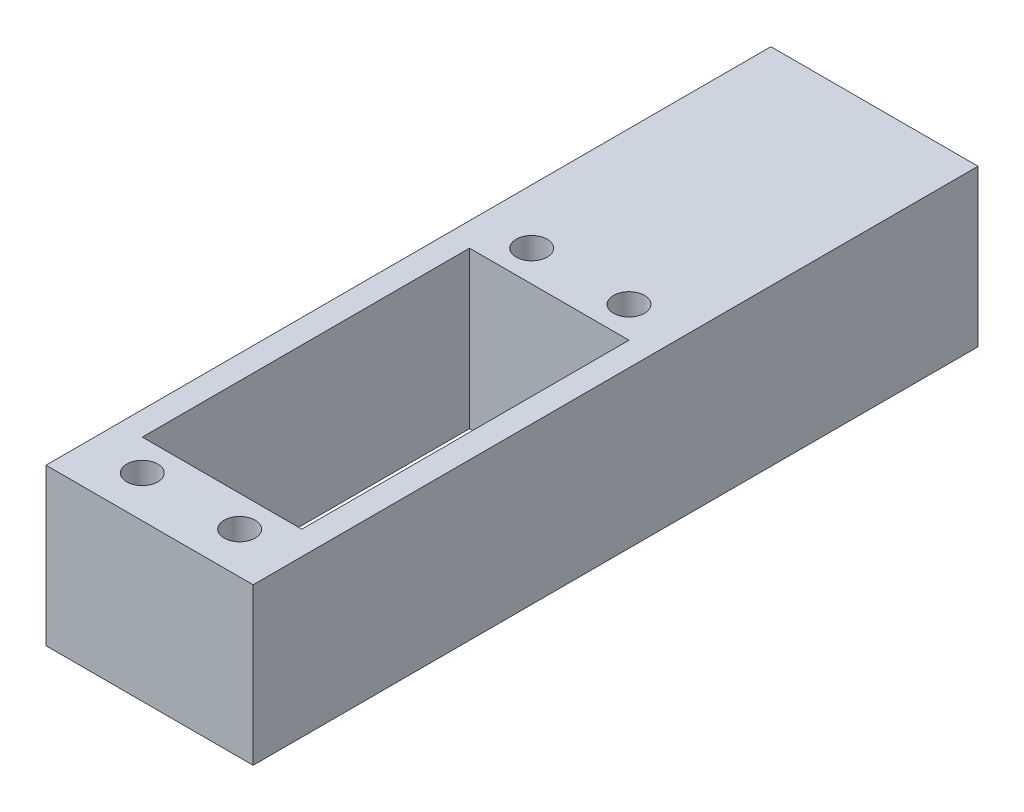
ISO-10303-21;
HEADER;
FILE_DESCRIPTION(('STEP AP214'),'2;1');
FILE_NAME('part.step','',(''),(''),'','','');
FILE_SCHEMA(('AUTOMOTIVE_DESIGN { 1 0 10303 214 1 1 1 1 }'));
ENDSEC;
DATA;
#1=APPLICATION_CONTEXT('core data for automotive mechanical design processes');
#2=APPLICATION_PROTOCOL_DEFINITION('international standard','automotive_design',2000,#1);
#3=PRODUCT_CONTEXT('',#1,'mechanical');
#4=PRODUCT('Part','Part','',(#3));
#5=PRODUCT_RELATED_PRODUCT_CATEGORY('part','',(#4));
#6=PRODUCT_DEFINITION_FORMATION('','',#4);
#7=PRODUCT_DEFINITION_CONTEXT('part definition',#1,'design');
#8=PRODUCT_DEFINITION('design','',#6,#7);
#9=PRODUCT_DEFINITION_SHAPE('','',#8);
#10=(LENGTH_UNIT() NAMED_UNIT(*) SI_UNIT(.MILLI.,.METRE.));
#11=(NAMED_UNIT(*) PLANE_ANGLE_UNIT() SI_UNIT($,.RADIAN.));
#12=(NAMED_UNIT(*) SI_UNIT($,.STERADIAN.) SOLID_ANGLE_UNIT());
#13=UNCERTAINTY_MEASURE_WITH_UNIT(LENGTH_MEASURE(1.E-05),#10,'distance_accuracy_value','');
#14=(GEOMETRIC_REPRESENTATION_CONTEXT(3) GLOBAL_UNCERTAINTY_ASSIGNED_CONTEXT((#13)) GLOBAL_UNIT_ASSIGNED_CONTEXT((#10,
#11,#12)) REPRESENTATION_CONTEXT('',''));
#15=CARTESIAN_POINT('',(0.,0.,0.));
#16=DIRECTION('',(0.,0.,1.));
#17=DIRECTION('',(1.,0.,0.));
#18=AXIS2_PLACEMENT_3D('',#15,#16,#17);
#19=CARTESIAN_POINT('',(0.,19.177,0.));
#20=DIRECTION('',(0.,-1.,0.));
#21=DIRECTION('',(0.,0.,-1.));
#22=AXIS2_PLACEMENT_3D('',#19,#20,#21);
#23=PLANE('',#22);
#24=DIRECTION('',(0.,0.,1.));
#25=VECTOR('',#24,1.);
#26=CARTESIAN_POINT('',(0.,19.177,0.));
#27=LINE('',#26,#25);
#28=CARTESIAN_POINT('',(0.,19.177,-88.9));
#29=VERTEX_POINT('',#28);
#30=CARTESIAN_POINT('',(0.,19.177,0.));
#31=VERTEX_POINT('',#30);
#32=EDGE_CURVE('E137',#29,#31,#27,.T.);
#33=ORIENTED_EDGE('',*,*,#32,.T.);
#34=DIRECTION('',(1.,0.,0.));
#35=VECTOR('',#34,1.);
#36=CARTESIAN_POINT('',(0.,19.177,0.));
#37=LINE('',#36,#35);
#38=CARTESIAN_POINT('',(25.4,19.177,0.));
#39=VERTEX_POINT('',#38);
#40=EDGE_CURVE('E140',#31,#39,#37,.T.);
#41=ORIENTED_EDGE('',*,*,#40,.T.);
#42=DIRECTION('',(0.,0.,-1.));
#43=VECTOR('',#42,1.);
#44=CARTESIAN_POINT('',(25.4,19.177,-88.9));
#45=LINE('',#44,#43);
#46=CARTESIAN_POINT('',(25.4,19.177,-88.9));
#47=VERTEX_POINT('',#46);
#48=EDGE_CURVE('E143',#39,#47,#45,.T.);
#49=ORIENTED_EDGE('',*,*,#48,.T.);
#50=DIRECTION('',(-1.,0.,0.));
#51=VECTOR('',#50,1.);
#52=CARTESIAN_POINT('',(0.,19.177,-88.9));
#53=LINE('',#52,#51);
#54=EDGE_CURVE('E145',#47,#29,#53,.T.);
#55=ORIENTED_EDGE('',*,*,#54,.T.);
#56=EDGE_LOOP('',(#33,#41,#49,#55));
#57=FACE_BOUND('',#56,.T.);
#58=DIRECTION('',(0.,0.,1.));
#59=VECTOR('',#58,1.);
#60=CARTESIAN_POINT('',(2.921,19.177,-8.89));
#61=LINE('',#60,#59);
#62=CARTESIAN_POINT('',(2.921,19.177,-49.022));
#63=VERTEX_POINT('',#62);
#64=CARTESIAN_POINT('',(2.921,19.177,-8.89));
#65=VERTEX_POINT('',#64);
#66=EDGE_CURVE('E98',#63,#65,#61,.T.);
#67=ORIENTED_EDGE('',*,*,#66,.F.);
#68=DIRECTION('',(-1.,0.,0.));
#69=VECTOR('',#68,1.);
#70=CARTESIAN_POINT('',(2.921,19.177,-49.022));
#71=LINE('',#70,#69);
#72=CARTESIAN_POINT('',(22.479,19.177,-49.022));
#73=VERTEX_POINT('',#72);
#74=EDGE_CURVE('E121',#73,#63,#71,.T.);
#75=ORIENTED_EDGE('',*,*,#74,.F.);
#76=DIRECTION('',(0.,0.,-1.));
#77=VECTOR('',#76,1.);
#78=CARTESIAN_POINT('',(22.479,19.177,-49.022));
#79=LINE('',#78,#77);
#80=CARTESIAN_POINT('',(22.479,19.177,-8.89));
#81=VERTEX_POINT('',#80);
#82=EDGE_CURVE('E119',#81,#73,#79,.T.);
#83=ORIENTED_EDGE('',*,*,#82,.F.);
#84=DIRECTION('',(1.,0.,0.));
#85=VECTOR('',#84,1.);
#86=CARTESIAN_POINT('',(2.921,19.177,-8.89));
#87=LINE('',#86,#85);
#88=EDGE_CURVE('E106',#65,#81,#87,.T.);
#89=ORIENTED_EDGE('',*,*,#88,.F.);
#90=EDGE_LOOP('',(#67,#75,#83,#89));
#91=FACE_BOUND('',#90,.T.);
#92=CARTESIAN_POINT('',(6.731,19.177,-52.832));
#93=DIRECTION('',(0.,1.,0.));
#94=DIRECTION('',(0.,0.,1.));
#95=AXIS2_PLACEMENT_3D('',#92,#93,#94);
#96=CIRCLE('',#95,1.905);
#97=CARTESIAN_POINT('',(6.731,19.177,-54.737));
#98=VERTEX_POINT('',#97);
#99=EDGE_CURVE('E127',#98,#98,#96,.T.);
#100=ORIENTED_EDGE('',*,*,#99,.F.);
#101=EDGE_LOOP('',(#100));
#102=FACE_BOUND('',#101,.T.);
#103=CARTESIAN_POINT('',(18.669,19.177,-52.832));
#104=DIRECTION('',(0.,1.,0.));
#105=DIRECTION('',(0.,0.,1.));
#106=AXIS2_PLACEMENT_3D('',#103,#104,#105);
#107=CIRCLE('',#106,1.905);
#108=CARTESIAN_POINT('',(18.669,19.177,-54.737));
#109=VERTEX_POINT('',#108);
#110=EDGE_CURVE('E249',#109,#109,#107,.T.);
#111=ORIENTED_EDGE('',*,*,#110,.F.);
#112=EDGE_LOOP('',(#111));
#113=FACE_BOUND('',#112,.T.);
#114=CARTESIAN_POINT('',(6.731,19.177,-5.08));
#115=DIRECTION('',(0.,1.,0.));
#116=DIRECTION('',(0.,0.,1.));
#117=AXIS2_PLACEMENT_3D('',#114,#115,#116);
#118=CIRCLE('',#117,1.905);
#119=CARTESIAN_POINT('',(6.731,19.177,-6.985));
#120=VERTEX_POINT('',#119);
#121=EDGE_CURVE('E243',#120,#120,#118,.T.);
#122=ORIENTED_EDGE('',*,*,#121,.F.);
#123=EDGE_LOOP('',(#122));
#124=FACE_BOUND('',#123,.T.);
#125=CARTESIAN_POINT('',(18.669,19.177,-5.08));
#126=DIRECTION('',(0.,1.,0.));
#127=DIRECTION('',(0.,0.,1.));
#128=AXIS2_PLACEMENT_3D('',#125,#126,#127);
#129=CIRCLE('',#128,1.905);
#130=CARTESIAN_POINT('',(18.669,19.177,-6.985));
#131=VERTEX_POINT('',#130);
#132=EDGE_CURVE('E234',#131,#131,#129,.T.);
#133=ORIENTED_EDGE('',*,*,#132,.F.);
#134=EDGE_LOOP('',(#133));
#135=FACE_BOUND('',#134,.T.);
#136=ADVANCED_FACE('F33',(#57,#91,#102,#113,#124,#135),#23,.F.);
#137=CARTESIAN_POINT('',(0.,0.,0.));
#138=DIRECTION('',(0.,-1.,0.));
#139=DIRECTION('',(0.,0.,-1.));
#140=AXIS2_PLACEMENT_3D('',#137,#138,#139);
#141=PLANE('',#140);
#142=CARTESIAN_POINT('',(6.731,0.,-5.08));
#143=DIRECTION('',(0.,1.,0.));
#144=DIRECTION('',(0.,0.,1.));
#145=AXIS2_PLACEMENT_3D('',#142,#143,#144);
#146=CIRCLE('',#145,1.905);
#147=CARTESIAN_POINT('',(6.731,0.,-6.985));
#148=VERTEX_POINT('',#147);
#149=EDGE_CURVE('E240',#148,#148,#146,.T.);
#150=ORIENTED_EDGE('',*,*,#149,.T.);
#151=EDGE_LOOP('',(#150));
#152=FACE_BOUND('',#151,.T.);
#153=CARTESIAN_POINT('',(6.731,0.,-52.832));
#154=DIRECTION('',(0.,1.,0.));
#155=DIRECTION('',(0.,0.,1.));
#156=AXIS2_PLACEMENT_3D('',#153,#154,#155);
#157=CIRCLE('',#156,1.905);
#158=CARTESIAN_POINT('',(6.731,0.,-54.737));
#159=VERTEX_POINT('',#158);
#160=EDGE_CURVE('E252',#159,#159,#157,.T.);
#161=ORIENTED_EDGE('',*,*,#160,.T.);
#162=EDGE_LOOP('',(#161));
#163=FACE_BOUND('',#162,.T.);
#164=DIRECTION('',(0.,0.,1.));
#165=VECTOR('',#164,1.);
#166=CARTESIAN_POINT('',(0.,0.,0.));
#167=LINE('',#166,#165);
#168=CARTESIAN_POINT('',(0.,0.,-88.9));
#169=VERTEX_POINT('',#168);
#170=CARTESIAN_POINT('',(0.,0.,0.));
#171=VERTEX_POINT('',#170);
#172=EDGE_CURVE('E114',#169,#171,#167,.T.);
#173=ORIENTED_EDGE('',*,*,#172,.F.);
#174=DIRECTION('',(-1.,0.,0.));
#175=VECTOR('',#174,1.);
#176=CARTESIAN_POINT('',(0.,0.,-88.9));
#177=LINE('',#176,#175);
#178=CARTESIAN_POINT('',(25.4,0.,-88.9));
#179=VERTEX_POINT('',#178);
#180=EDGE_CURVE('E141',#179,#169,#177,.T.);
#181=ORIENTED_EDGE('',*,*,#180,.F.);
#182=DIRECTION('',(0.,0.,-1.));
#183=VECTOR('',#182,1.);
#184=CARTESIAN_POINT('',(25.4,0.,-88.9));
#185=LINE('',#184,#183);
#186=CARTESIAN_POINT('',(25.4,0.,0.));
#187=VERTEX_POINT('',#186);
#188=EDGE_CURVE('E152',#187,#179,#185,.T.);
#189=ORIENTED_EDGE('',*,*,#188,.F.);
#190=DIRECTION('',(1.,0.,0.));
#191=VECTOR('',#190,1.);
#192=CARTESIAN_POINT('',(0.,0.,0.));
#193=LINE('',#192,#191);
#194=EDGE_CURVE('E150',#171,#187,#193,.T.);
#195=ORIENTED_EDGE('',*,*,#194,.F.);
#196=EDGE_LOOP('',(#173,#181,#189,#195));
#197=FACE_BOUND('',#196,.T.);
#198=DIRECTION('',(-1.,0.,0.));
#199=VECTOR('',#198,1.);
#200=CARTESIAN_POINT('',(2.921,0.,-49.022));
#201=LINE('',#200,#199);
#202=CARTESIAN_POINT('',(22.479,0.,-49.022));
#203=VERTEX_POINT('',#202);
#204=CARTESIAN_POINT('',(2.921,0.,-49.022));
#205=VERTEX_POINT('',#204);
#206=EDGE_CURVE('E107',#203,#205,#201,.T.);
#207=ORIENTED_EDGE('',*,*,#206,.T.);
#208=DIRECTION('',(0.,0.,1.));
#209=VECTOR('',#208,1.);
#210=CARTESIAN_POINT('',(2.921,0.,-8.89));
#211=LINE('',#210,#209);
#212=CARTESIAN_POINT('',(2.921,0.,-8.89));
#213=VERTEX_POINT('',#212);
#214=EDGE_CURVE('E56',#205,#213,#211,.T.);
#215=ORIENTED_EDGE('',*,*,#214,.T.);
#216=DIRECTION('',(1.,0.,0.));
#217=VECTOR('',#216,1.);
#218=CARTESIAN_POINT('',(2.921,0.,-8.89));
#219=LINE('',#218,#217);
#220=CARTESIAN_POINT('',(22.479,0.,-8.89));
#221=VERTEX_POINT('',#220);
#222=EDGE_CURVE('E113',#213,#221,#219,.T.);
#223=ORIENTED_EDGE('',*,*,#222,.T.);
#224=DIRECTION('',(0.,0.,-1.));
#225=VECTOR('',#224,1.);
#226=CARTESIAN_POINT('',(22.479,0.,-49.022));
#227=LINE('',#226,#225);
#228=EDGE_CURVE('E129',#221,#203,#227,.T.);
#229=ORIENTED_EDGE('',*,*,#228,.T.);
#230=EDGE_LOOP('',(#207,#215,#223,#229));
#231=FACE_BOUND('',#230,.T.);
#232=CARTESIAN_POINT('',(18.669,0.,-52.832));
#233=DIRECTION('',(0.,1.,0.));
#234=DIRECTION('',(0.,0.,1.));
#235=AXIS2_PLACEMENT_3D('',#232,#233,#234);
#236=CIRCLE('',#235,1.905);
#237=CARTESIAN_POINT('',(18.669,0.,-54.737));
#238=VERTEX_POINT('',#237);
#239=EDGE_CURVE('E246',#238,#238,#236,.T.);
#240=ORIENTED_EDGE('',*,*,#239,.T.);
#241=EDGE_LOOP('',(#240));
#242=FACE_BOUND('',#241,.T.);
#243=CARTESIAN_POINT('',(18.669,0.,-5.08));
#244=DIRECTION('',(0.,1.,0.));
#245=DIRECTION('',(0.,0.,1.));
#246=AXIS2_PLACEMENT_3D('',#243,#244,#245);
#247=CIRCLE('',#246,1.905);
#248=CARTESIAN_POINT('',(18.669,0.,-6.985));
#249=VERTEX_POINT('',#248);
#250=EDGE_CURVE('E237',#249,#249,#247,.T.);
#251=ORIENTED_EDGE('',*,*,#250,.T.);
#252=EDGE_LOOP('',(#251));
#253=FACE_BOUND('',#252,.T.);
#254=ADVANCED_FACE('F170',(#152,#163,#197,#231,#242,#253),#141,.T.);
#255=CARTESIAN_POINT('',(0.,19.177,0.));
#256=DIRECTION('',(1.,0.,0.));
#257=DIRECTION('',(0.,0.,-1.));
#258=AXIS2_PLACEMENT_3D('',#255,#256,#257);
#259=PLANE('',#258);
#260=ORIENTED_EDGE('',*,*,#172,.T.);
#261=DIRECTION('',(0.,-1.,0.));
#262=VECTOR('',#261,1.);
#263=CARTESIAN_POINT('',(0.,19.177,0.));
#264=LINE('',#263,#262);
#265=EDGE_CURVE('E11',#31,#171,#264,.T.);
#266=ORIENTED_EDGE('',*,*,#265,.F.);
#267=ORIENTED_EDGE('',*,*,#32,.F.);
#268=DIRECTION('',(0.,-1.,0.));
#269=VECTOR('',#268,1.);
#270=CARTESIAN_POINT('',(0.,19.177,-88.9));
#271=LINE('',#270,#269);
#272=EDGE_CURVE('E147',#29,#169,#271,.T.);
#273=ORIENTED_EDGE('',*,*,#272,.T.);
#274=EDGE_LOOP('',(#260,#266,#267,#273));
#275=FACE_BOUND('',#274,.T.);
#276=ADVANCED_FACE('F35',(#275),#259,.F.);
#277=CARTESIAN_POINT('',(0.,19.177,0.));
#278=DIRECTION('',(0.,0.,-1.));
#279=DIRECTION('',(-1.,0.,0.));
#280=AXIS2_PLACEMENT_3D('',#277,#278,#279);
#281=PLANE('',#280);
#282=ORIENTED_EDGE('',*,*,#194,.T.);
#283=DIRECTION('',(0.,-1.,0.));
#284=VECTOR('',#283,1.);
#285=CARTESIAN_POINT('',(25.4,19.177,0.));
#286=LINE('',#285,#284);
#287=EDGE_CURVE('E41',#39,#187,#286,.T.);
#288=ORIENTED_EDGE('',*,*,#287,.F.);
#289=ORIENTED_EDGE('',*,*,#40,.F.);
#290=ORIENTED_EDGE('',*,*,#265,.T.);
#291=EDGE_LOOP('',(#282,#288,#289,#290));
#292=FACE_BOUND('',#291,.T.);
#293=ADVANCED_FACE('F180',(#292),#281,.F.);
#294=CARTESIAN_POINT('',(25.4,19.177,-88.9));
#295=DIRECTION('',(-1.,0.,0.));
#296=DIRECTION('',(0.,0.,1.));
#297=AXIS2_PLACEMENT_3D('',#294,#295,#296);
#298=PLANE('',#297);
#299=ORIENTED_EDGE('',*,*,#188,.T.);
#300=DIRECTION('',(0.,-1.,0.));
#301=VECTOR('',#300,1.);
#302=CARTESIAN_POINT('',(25.4,19.177,-88.9));
#303=LINE('',#302,#301);
#304=EDGE_CURVE('E157',#47,#179,#303,.T.);
#305=ORIENTED_EDGE('',*,*,#304,.F.);
#306=ORIENTED_EDGE('',*,*,#48,.F.);
#307=ORIENTED_EDGE('',*,*,#287,.T.);
#308=EDGE_LOOP('',(#299,#305,#306,#307));
#309=FACE_BOUND('',#308,.T.);
#310=ADVANCED_FACE('F164',(#309),#298,.F.);
#311=CARTESIAN_POINT('',(0.,19.177,-88.9));
#312=DIRECTION('',(0.,0.,1.));
#313=DIRECTION('',(1.,0.,0.));
#314=AXIS2_PLACEMENT_3D('',#311,#312,#313);
#315=PLANE('',#314);
#316=ORIENTED_EDGE('',*,*,#180,.T.);
#317=ORIENTED_EDGE('',*,*,#272,.F.);
#318=ORIENTED_EDGE('',*,*,#54,.F.);
#319=ORIENTED_EDGE('',*,*,#304,.T.);
#320=EDGE_LOOP('',(#316,#317,#318,#319));
#321=FACE_BOUND('',#320,.T.);
#322=ADVANCED_FACE('F174',(#321),#315,.F.);
#323=CARTESIAN_POINT('',(2.921,19.177,-8.89));
#324=DIRECTION('',(1.,0.,0.));
#325=DIRECTION('',(0.,0.,-1.));
#326=AXIS2_PLACEMENT_3D('',#323,#324,#325);
#327=PLANE('',#326);
#328=ORIENTED_EDGE('',*,*,#214,.F.);
#329=DIRECTION('',(0.,-1.,0.));
#330=VECTOR('',#329,1.);
#331=CARTESIAN_POINT('',(2.921,19.177,-49.022));
#332=LINE('',#331,#330);
#333=EDGE_CURVE('E102',#63,#205,#332,.T.);
#334=ORIENTED_EDGE('',*,*,#333,.F.);
#335=ORIENTED_EDGE('',*,*,#66,.T.);
#336=DIRECTION('',(0.,-1.,0.));
#337=VECTOR('',#336,1.);
#338=CARTESIAN_POINT('',(2.921,19.177,-8.89));
#339=LINE('',#338,#337);
#340=EDGE_CURVE('E101',#65,#213,#339,.T.);
#341=ORIENTED_EDGE('',*,*,#340,.T.);
#342=EDGE_LOOP('',(#328,#334,#335,#341));
#343=FACE_BOUND('',#342,.T.);
#344=ADVANCED_FACE('F100',(#343),#327,.T.);
#345=CARTESIAN_POINT('',(2.921,19.177,-8.89));
#346=DIRECTION('',(0.,0.,-1.));
#347=DIRECTION('',(-1.,0.,0.));
#348=AXIS2_PLACEMENT_3D('',#345,#346,#347);
#349=PLANE('',#348);
#350=ORIENTED_EDGE('',*,*,#222,.F.);
#351=ORIENTED_EDGE('',*,*,#340,.F.);
#352=ORIENTED_EDGE('',*,*,#88,.T.);
#353=DIRECTION('',(0.,-1.,0.));
#354=VECTOR('',#353,1.);
#355=CARTESIAN_POINT('',(22.479,19.177,-8.89));
#356=LINE('',#355,#354);
#357=EDGE_CURVE('E115',#81,#221,#356,.T.);
#358=ORIENTED_EDGE('',*,*,#357,.T.);
#359=EDGE_LOOP('',(#350,#351,#352,#358));
#360=FACE_BOUND('',#359,.T.);
#361=ADVANCED_FACE('F110',(#360),#349,.T.);
#362=CARTESIAN_POINT('',(22.479,19.177,-49.022));
#363=DIRECTION('',(-1.,0.,0.));
#364=DIRECTION('',(0.,0.,1.));
#365=AXIS2_PLACEMENT_3D('',#362,#363,#364);
#366=PLANE('',#365);
#367=ORIENTED_EDGE('',*,*,#228,.F.);
#368=ORIENTED_EDGE('',*,*,#357,.F.);
#369=ORIENTED_EDGE('',*,*,#82,.T.);
#370=DIRECTION('',(0.,-1.,0.));
#371=VECTOR('',#370,1.);
#372=CARTESIAN_POINT('',(22.479,19.177,-49.022));
#373=LINE('',#372,#371);
#374=EDGE_CURVE('E48',#73,#203,#373,.T.);
#375=ORIENTED_EDGE('',*,*,#374,.T.);
#376=EDGE_LOOP('',(#367,#368,#369,#375));
#377=FACE_BOUND('',#376,.T.);
#378=ADVANCED_FACE('F204',(#377),#366,.T.);
#379=CARTESIAN_POINT('',(2.921,19.177,-49.022));
#380=DIRECTION('',(0.,0.,1.));
#381=DIRECTION('',(1.,0.,0.));
#382=AXIS2_PLACEMENT_3D('',#379,#380,#381);
#383=PLANE('',#382);
#384=ORIENTED_EDGE('',*,*,#206,.F.);
#385=ORIENTED_EDGE('',*,*,#374,.F.);
#386=ORIENTED_EDGE('',*,*,#74,.T.);
#387=ORIENTED_EDGE('',*,*,#333,.T.);
#388=EDGE_LOOP('',(#384,#385,#386,#387));
#389=FACE_BOUND('',#388,.T.);
#390=ADVANCED_FACE('F208',(#389),#383,.T.);
#391=CARTESIAN_POINT('',(6.731,19.177,-52.832));
#392=DIRECTION('',(0.,-1.,0.));
#393=DIRECTION('',(0.,0.,-1.));
#394=AXIS2_PLACEMENT_3D('',#391,#392,#393);
#395=CYLINDRICAL_SURFACE('',#394,1.905);
#396=CARTESIAN_POINT('',(6.731,19.177,-54.737));
#397=CARTESIAN_POINT('',(6.731,18.9772395833333,-54.737));
#398=CARTESIAN_POINT('',(6.731,18.7774791666667,-54.737));
#399=CARTESIAN_POINT('',(6.731,18.3779583333333,-54.737));
#400=CARTESIAN_POINT('',(6.731,18.1781979166667,-54.737));
#401=CARTESIAN_POINT('',(6.731,17.7786770833333,-54.737));
#402=CARTESIAN_POINT('',(6.731,17.5789166666667,-54.737));
#403=CARTESIAN_POINT('',(6.731,17.1793958333333,-54.737));
#404=CARTESIAN_POINT('',(6.731,16.9796354166667,-54.737));
#405=CARTESIAN_POINT('',(6.731,16.5801145833333,-54.737));
#406=CARTESIAN_POINT('',(6.731,16.3803541666667,-54.737));
#407=CARTESIAN_POINT('',(6.731,15.9808333333333,-54.737));
#408=CARTESIAN_POINT('',(6.731,15.7810729166667,-54.737));
#409=CARTESIAN_POINT('',(6.731,15.3815520833333,-54.737));
#410=CARTESIAN_POINT('',(6.731,15.1817916666667,-54.737));
#411=CARTESIAN_POINT('',(6.731,14.7822708333333,-54.737));
#412=CARTESIAN_POINT('',(6.731,14.5825104166667,-54.737));
#413=CARTESIAN_POINT('',(6.731,14.1829895833333,-54.737));
#414=CARTESIAN_POINT('',(6.731,13.9832291666667,-54.737));
#415=CARTESIAN_POINT('',(6.731,13.5837083333333,-54.737));
#416=CARTESIAN_POINT('',(6.731,13.3839479166667,-54.737));
#417=CARTESIAN_POINT('',(6.731,12.9844270833333,-54.737));
#418=CARTESIAN_POINT('',(6.731,12.7846666666667,-54.737));
#419=CARTESIAN_POINT('',(6.731,12.3851458333333,-54.737));
#420=CARTESIAN_POINT('',(6.731,12.1853854166667,-54.737));
#421=CARTESIAN_POINT('',(6.731,11.7858645833333,-54.737));
#422=CARTESIAN_POINT('',(6.731,11.5861041666667,-54.737));
#423=CARTESIAN_POINT('',(6.731,11.1865833333333,-54.737));
#424=CARTESIAN_POINT('',(6.731,10.9868229166667,-54.737));
#425=CARTESIAN_POINT('',(6.731,10.5873020833333,-54.737));
#426=CARTESIAN_POINT('',(6.731,10.3875416666667,-54.737));
#427=CARTESIAN_POINT('',(6.731,9.98802083333333,-54.737));
#428=CARTESIAN_POINT('',(6.731,9.78826041666666,-54.737));
#429=CARTESIAN_POINT('',(6.731,9.38873958333333,-54.737));
#430=CARTESIAN_POINT('',(6.731,9.18897916666666,-54.737));
#431=CARTESIAN_POINT('',(6.731,8.78945833333333,-54.737));
#432=CARTESIAN_POINT('',(6.731,8.58969791666666,-54.737));
#433=CARTESIAN_POINT('',(6.731,8.19017708333333,-54.737));
#434=CARTESIAN_POINT('',(6.731,7.99041666666666,-54.737));
#435=CARTESIAN_POINT('',(6.731,7.59089583333333,-54.737));
#436=CARTESIAN_POINT('',(6.731,7.39113541666666,-54.737));
#437=CARTESIAN_POINT('',(6.731,6.99161458333333,-54.737));
#438=CARTESIAN_POINT('',(6.731,6.79185416666666,-54.737));
#439=CARTESIAN_POINT('',(6.731,6.39233333333333,-54.737));
#440=CARTESIAN_POINT('',(6.731,6.19257291666666,-54.737));
#441=CARTESIAN_POINT('',(6.731,5.79305208333333,-54.737));
#442=CARTESIAN_POINT('',(6.731,5.59329166666666,-54.737));
#443=CARTESIAN_POINT('',(6.731,5.19377083333333,-54.737));
#444=CARTESIAN_POINT('',(6.731,4.99401041666666,-54.737));
#445=CARTESIAN_POINT('',(6.731,4.59448958333333,-54.737));
#446=CARTESIAN_POINT('',(6.731,4.39472916666666,-54.737));
#447=CARTESIAN_POINT('',(6.731,3.99520833333333,-54.737));
#448=CARTESIAN_POINT('',(6.731,3.79544791666666,-54.737));
#449=CARTESIAN_POINT('',(6.731,3.39592708333333,-54.737));
#450=CARTESIAN_POINT('',(6.731,3.19616666666666,-54.737));
#451=CARTESIAN_POINT('',(6.731,2.79664583333333,-54.737));
#452=CARTESIAN_POINT('',(6.731,2.59688541666666,-54.737));
#453=CARTESIAN_POINT('',(6.731,2.19736458333333,-54.737));
#454=CARTESIAN_POINT('',(6.731,1.99760416666666,-54.737));
#455=CARTESIAN_POINT('',(6.731,1.59808333333333,-54.737));
#456=CARTESIAN_POINT('',(6.731,1.39832291666666,-54.737));
#457=CARTESIAN_POINT('',(6.731,0.99880208333333,-54.737));
#458=CARTESIAN_POINT('',(6.731,0.799041666666663,-54.737));
#459=CARTESIAN_POINT('',(6.731,0.39952083333333,-54.737));
#460=CARTESIAN_POINT('',(6.731,0.199760416666663,-54.737));
#461=CARTESIAN_POINT('',(6.731,0.,-54.737));
#462=B_SPLINE_CURVE_WITH_KNOTS('',3,(#396,#397,#398,#399,#400,#401,#402,#403,#404,#405,#406,
#407,#408,#409,#410,#411,#412,#413,#414,#415,#416,#417,#418,#419,#420,#421,#422,#423,#424,#425,
#426,#427,#428,#429,#430,#431,#432,#433,#434,#435,#436,#437,#438,#439,#440,#441,#442,#443,#444,
#445,#446,#447,#448,#449,#450,#451,#452,#453,#454,#455,#456,#457,#458,#459,#460,#461),
.UNSPECIFIED.,.F.,.F.,(4,2,2,2,2,2,2,2,2,2,2,2,2,2,2,2,2,2,2,2,2,2,2,2,2,2,2,2,2,2,2,2,4),(0.,
0.599281250000003,1.1985625,1.79784375,2.397125,2.99640625,3.5956875,4.19496875,4.79425,
5.39353125,5.9928125,6.59209375,7.191375,7.79065625,8.3899375,8.98921875,9.5885,10.18778125,
10.7870625,11.38634375,11.985625,12.58490625,13.1841875,13.78346875,14.38275,14.98203125,
15.5813125,16.18059375,16.779875,17.37915625,17.9784375,18.57771875,19.177),.UNSPECIFIED.);
#463=EDGE_CURVE('BSEAM214',#98,#159,#462,.T.);
#464=ORIENTED_EDGE('',*,*,#99,.T.);
#465=ORIENTED_EDGE('',*,*,#160,.F.);
#466=ORIENTED_EDGE('',*,*,#463,.T.);
#467=ORIENTED_EDGE('',*,*,#463,.F.);
#468=EDGE_LOOP('',(#464,#466,#465,#467));
#469=FACE_BOUND('',#468,.T.);
#470=ADVANCED_FACE('F214',(#469),#395,.F.);
#471=CARTESIAN_POINT('',(18.669,19.177,-52.832));
#472=DIRECTION('',(0.,-1.,0.));
#473=DIRECTION('',(0.,0.,-1.));
#474=AXIS2_PLACEMENT_3D('',#471,#472,#473);
#475=CYLINDRICAL_SURFACE('',#474,1.905);
#476=CARTESIAN_POINT('',(18.669,19.177,-54.737));
#477=CARTESIAN_POINT('',(18.669,18.9772395833333,-54.737));
#478=CARTESIAN_POINT('',(18.669,18.7774791666667,-54.737));
#479=CARTESIAN_POINT('',(18.669,18.3779583333333,-54.737));
#480=CARTESIAN_POINT('',(18.669,18.1781979166667,-54.737));
#481=CARTESIAN_POINT('',(18.669,17.7786770833333,-54.737));
#482=CARTESIAN_POINT('',(18.669,17.5789166666667,-54.737));
#483=CARTESIAN_POINT('',(18.669,17.1793958333333,-54.737));
#484=CARTESIAN_POINT('',(18.669,16.9796354166667,-54.737));
#485=CARTESIAN_POINT('',(18.669,16.5801145833333,-54.737));
#486=CARTESIAN_POINT('',(18.669,16.3803541666667,-54.737));
#487=CARTESIAN_POINT('',(18.669,15.9808333333333,-54.737));
#488=CARTESIAN_POINT('',(18.669,15.7810729166667,-54.737));
#489=CARTESIAN_POINT('',(18.669,15.3815520833333,-54.737));
#490=CARTESIAN_POINT('',(18.669,15.1817916666667,-54.737));
#491=CARTESIAN_POINT('',(18.669,14.7822708333333,-54.737));
#492=CARTESIAN_POINT('',(18.669,14.5825104166667,-54.737));
#493=CARTESIAN_POINT('',(18.669,14.1829895833333,-54.737));
#494=CARTESIAN_POINT('',(18.669,13.9832291666667,-54.737));
#495=CARTESIAN_POINT('',(18.669,13.5837083333333,-54.737));
#496=CARTESIAN_POINT('',(18.669,13.3839479166667,-54.737));
#497=CARTESIAN_POINT('',(18.669,12.9844270833333,-54.737));
#498=CARTESIAN_POINT('',(18.669,12.7846666666667,-54.737));
#499=CARTESIAN_POINT('',(18.669,12.3851458333333,-54.737));
#500=CARTESIAN_POINT('',(18.669,12.1853854166667,-54.737));
#501=CARTESIAN_POINT('',(18.669,11.7858645833333,-54.737));
#502=CARTESIAN_POINT('',(18.669,11.5861041666667,-54.737));
#503=CARTESIAN_POINT('',(18.669,11.1865833333333,-54.737));
#504=CARTESIAN_POINT('',(18.669,10.9868229166667,-54.737));
#505=CARTESIAN_POINT('',(18.669,10.5873020833333,-54.737));
#506=CARTESIAN_POINT('',(18.669,10.3875416666667,-54.737));
#507=CARTESIAN_POINT('',(18.669,9.98802083333333,-54.737));
#508=CARTESIAN_POINT('',(18.669,9.78826041666666,-54.737));
#509=CARTESIAN_POINT('',(18.669,9.38873958333333,-54.737));
#510=CARTESIAN_POINT('',(18.669,9.18897916666666,-54.737));
#511=CARTESIAN_POINT('',(18.669,8.78945833333333,-54.737));
#512=CARTESIAN_POINT('',(18.669,8.58969791666666,-54.737));
#513=CARTESIAN_POINT('',(18.669,8.19017708333333,-54.737));
#514=CARTESIAN_POINT('',(18.669,7.99041666666666,-54.737));
#515=CARTESIAN_POINT('',(18.669,7.59089583333333,-54.737));
#516=CARTESIAN_POINT('',(18.669,7.39113541666666,-54.737));
#517=CARTESIAN_POINT('',(18.669,6.99161458333333,-54.737));
#518=CARTESIAN_POINT('',(18.669,6.79185416666666,-54.737));
#519=CARTESIAN_POINT('',(18.669,6.39233333333333,-54.737));
#520=CARTESIAN_POINT('',(18.669,6.19257291666666,-54.737));
#521=CARTESIAN_POINT('',(18.669,5.79305208333333,-54.737));
#522=CARTESIAN_POINT('',(18.669,5.59329166666666,-54.737));
#523=CARTESIAN_POINT('',(18.669,5.19377083333333,-54.737));
#524=CARTESIAN_POINT('',(18.669,4.99401041666666,-54.737));
#525=CARTESIAN_POINT('',(18.669,4.59448958333333,-54.737));
#526=CARTESIAN_POINT('',(18.669,4.39472916666666,-54.737));
#527=CARTESIAN_POINT('',(18.669,3.99520833333333,-54.737));
#528=CARTESIAN_POINT('',(18.669,3.79544791666666,-54.737));
#529=CARTESIAN_POINT('',(18.669,3.39592708333333,-54.737));
#530=CARTESIAN_POINT('',(18.669,3.19616666666666,-54.737));
#531=CARTESIAN_POINT('',(18.669,2.79664583333333,-54.737));
#532=CARTESIAN_POINT('',(18.669,2.59688541666666,-54.737));
#533=CARTESIAN_POINT('',(18.669,2.19736458333333,-54.737));
#534=CARTESIAN_POINT('',(18.669,1.99760416666666,-54.737));
#535=CARTESIAN_POINT('',(18.669,1.59808333333333,-54.737));
#536=CARTESIAN_POINT('',(18.669,1.39832291666666,-54.737));
#537=CARTESIAN_POINT('',(18.669,0.99880208333333,-54.737));
#538=CARTESIAN_POINT('',(18.669,0.799041666666663,-54.737));
#539=CARTESIAN_POINT('',(18.669,0.39952083333333,-54.737));
#540=CARTESIAN_POINT('',(18.669,0.199760416666663,-54.737));
#541=CARTESIAN_POINT('',(18.669,0.,-54.737));
#542=B_SPLINE_CURVE_WITH_KNOTS('',3,(#476,#477,#478,#479,#480,#481,#482,#483,#484,#485,#486,
#487,#488,#489,#490,#491,#492,#493,#494,#495,#496,#497,#498,#499,#500,#501,#502,#503,#504,#505,
#506,#507,#508,#509,#510,#511,#512,#513,#514,#515,#516,#517,#518,#519,#520,#521,#522,#523,#524,
#525,#526,#527,#528,#529,#530,#531,#532,#533,#534,#535,#536,#537,#538,#539,#540,#541),
.UNSPECIFIED.,.F.,.F.,(4,2,2,2,2,2,2,2,2,2,2,2,2,2,2,2,2,2,2,2,2,2,2,2,2,2,2,2,2,2,2,2,4),(0.,
0.599281250000003,1.1985625,1.79784375,2.397125,2.99640625,3.5956875,4.19496875,4.79425,
5.39353125,5.9928125,6.59209375,7.191375,7.79065625,8.3899375,8.98921875,9.5885,10.18778125,
10.7870625,11.38634375,11.985625,12.58490625,13.1841875,13.78346875,14.38275,14.98203125,
15.5813125,16.18059375,16.779875,17.37915625,17.9784375,18.57771875,19.177),.UNSPECIFIED.);
#543=EDGE_CURVE('BSEAM217',#109,#238,#542,.T.);
#544=ORIENTED_EDGE('',*,*,#110,.T.);
#545=ORIENTED_EDGE('',*,*,#239,.F.);
#546=ORIENTED_EDGE('',*,*,#543,.T.);
#547=ORIENTED_EDGE('',*,*,#543,.F.);
#548=EDGE_LOOP('',(#544,#546,#545,#547));
#549=FACE_BOUND('',#548,.T.);
#550=ADVANCED_FACE('F217',(#549),#475,.F.);
#551=CARTESIAN_POINT('',(6.731,19.177,-5.08));
#552=DIRECTION('',(0.,-1.,0.));
#553=DIRECTION('',(0.,0.,-1.));
#554=AXIS2_PLACEMENT_3D('',#551,#552,#553);
#555=CYLINDRICAL_SURFACE('',#554,1.905);
#556=CARTESIAN_POINT('',(6.731,19.177,-6.985));
#557=CARTESIAN_POINT('',(6.731,18.9772395833333,-6.985));
#558=CARTESIAN_POINT('',(6.731,18.7774791666667,-6.985));
#559=CARTESIAN_POINT('',(6.731,18.3779583333333,-6.985));
#560=CARTESIAN_POINT('',(6.731,18.1781979166667,-6.985));
#561=CARTESIAN_POINT('',(6.731,17.7786770833333,-6.985));
#562=CARTESIAN_POINT('',(6.731,17.5789166666667,-6.985));
#563=CARTESIAN_POINT('',(6.731,17.1793958333333,-6.985));
#564=CARTESIAN_POINT('',(6.731,16.9796354166667,-6.985));
#565=CARTESIAN_POINT('',(6.731,16.5801145833333,-6.985));
#566=CARTESIAN_POINT('',(6.731,16.3803541666667,-6.985));
#567=CARTESIAN_POINT('',(6.731,15.9808333333333,-6.985));
#568=CARTESIAN_POINT('',(6.731,15.7810729166667,-6.985));
#569=CARTESIAN_POINT('',(6.731,15.3815520833333,-6.985));
#570=CARTESIAN_POINT('',(6.731,15.1817916666667,-6.985));
#571=CARTESIAN_POINT('',(6.731,14.7822708333333,-6.985));
#572=CARTESIAN_POINT('',(6.731,14.5825104166667,-6.985));
#573=CARTESIAN_POINT('',(6.731,14.1829895833333,-6.985));
#574=CARTESIAN_POINT('',(6.731,13.9832291666667,-6.985));
#575=CARTESIAN_POINT('',(6.731,13.5837083333333,-6.985));
#576=CARTESIAN_POINT('',(6.731,13.3839479166667,-6.985));
#577=CARTESIAN_POINT('',(6.731,12.9844270833333,-6.985));
#578=CARTESIAN_POINT('',(6.731,12.7846666666667,-6.985));
#579=CARTESIAN_POINT('',(6.731,12.3851458333333,-6.985));
#580=CARTESIAN_POINT('',(6.731,12.1853854166667,-6.985));
#581=CARTESIAN_POINT('',(6.731,11.7858645833333,-6.985));
#582=CARTESIAN_POINT('',(6.731,11.5861041666667,-6.985));
#583=CARTESIAN_POINT('',(6.731,11.1865833333333,-6.985));
#584=CARTESIAN_POINT('',(6.731,10.9868229166667,-6.985));
#585=CARTESIAN_POINT('',(6.731,10.5873020833333,-6.985));
#586=CARTESIAN_POINT('',(6.731,10.3875416666667,-6.985));
#587=CARTESIAN_POINT('',(6.731,9.98802083333333,-6.985));
#588=CARTESIAN_POINT('',(6.731,9.78826041666666,-6.985));
#589=CARTESIAN_POINT('',(6.731,9.38873958333333,-6.985));
#590=CARTESIAN_POINT('',(6.731,9.18897916666666,-6.985));
#591=CARTESIAN_POINT('',(6.731,8.78945833333333,-6.985));
#592=CARTESIAN_POINT('',(6.731,8.58969791666666,-6.985));
#593=CARTESIAN_POINT('',(6.731,8.19017708333333,-6.985));
#594=CARTESIAN_POINT('',(6.731,7.99041666666666,-6.985));
#595=CARTESIAN_POINT('',(6.731,7.59089583333333,-6.985));
#596=CARTESIAN_POINT('',(6.731,7.39113541666666,-6.985));
#597=CARTESIAN_POINT('',(6.731,6.99161458333333,-6.985));
#598=CARTESIAN_POINT('',(6.731,6.79185416666666,-6.985));
#599=CARTESIAN_POINT('',(6.731,6.39233333333333,-6.985));
#600=CARTESIAN_POINT('',(6.731,6.19257291666666,-6.985));
#601=CARTESIAN_POINT('',(6.731,5.79305208333333,-6.985));
#602=CARTESIAN_POINT('',(6.731,5.59329166666666,-6.985));
#603=CARTESIAN_POINT('',(6.731,5.19377083333333,-6.985));
#604=CARTESIAN_POINT('',(6.731,4.99401041666666,-6.985));
#605=CARTESIAN_POINT('',(6.731,4.59448958333333,-6.985));
#606=CARTESIAN_POINT('',(6.731,4.39472916666666,-6.985));
#607=CARTESIAN_POINT('',(6.731,3.99520833333333,-6.985));
#608=CARTESIAN_POINT('',(6.731,3.79544791666666,-6.985));
#609=CARTESIAN_POINT('',(6.731,3.39592708333333,-6.985));
#610=CARTESIAN_POINT('',(6.731,3.19616666666666,-6.985));
#611=CARTESIAN_POINT('',(6.731,2.79664583333333,-6.985));
#612=CARTESIAN_POINT('',(6.731,2.59688541666666,-6.985));
#613=CARTESIAN_POINT('',(6.731,2.19736458333333,-6.985));
#614=CARTESIAN_POINT('',(6.731,1.99760416666666,-6.985));
#615=CARTESIAN_POINT('',(6.731,1.59808333333333,-6.985));
#616=CARTESIAN_POINT('',(6.731,1.39832291666666,-6.985));
#617=CARTESIAN_POINT('',(6.731,0.99880208333333,-6.985));
#618=CARTESIAN_POINT('',(6.731,0.799041666666663,-6.985));
#619=CARTESIAN_POINT('',(6.731,0.39952083333333,-6.985));
#620=CARTESIAN_POINT('',(6.731,0.199760416666663,-6.985));
#621=CARTESIAN_POINT('',(6.731,0.,-6.985));
#622=B_SPLINE_CURVE_WITH_KNOTS('',3,(#556,#557,#558,#559,#560,#561,#562,#563,#564,#565,#566,
#567,#568,#569,#570,#571,#572,#573,#574,#575,#576,#577,#578,#579,#580,#581,#582,#583,#584,#585,
#586,#587,#588,#589,#590,#591,#592,#593,#594,#595,#596,#597,#598,#599,#600,#601,#602,#603,#604,
#605,#606,#607,#608,#609,#610,#611,#612,#613,#614,#615,#616,#617,#618,#619,#620,#621),
.UNSPECIFIED.,.F.,.F.,(4,2,2,2,2,2,2,2,2,2,2,2,2,2,2,2,2,2,2,2,2,2,2,2,2,2,2,2,2,2,2,2,4),(0.,
0.599281250000003,1.1985625,1.79784375,2.397125,2.99640625,3.5956875,4.19496875,4.79425,
5.39353125,5.9928125,6.59209375,7.191375,7.79065625,8.3899375,8.98921875,9.5885,10.18778125,
10.7870625,11.38634375,11.985625,12.58490625,13.1841875,13.78346875,14.38275,14.98203125,
15.5813125,16.18059375,16.779875,17.37915625,17.9784375,18.57771875,19.177),.UNSPECIFIED.);
#623=EDGE_CURVE('BSEAM221',#120,#148,#622,.T.);
#624=ORIENTED_EDGE('',*,*,#121,.T.);
#625=ORIENTED_EDGE('',*,*,#149,.F.);
#626=ORIENTED_EDGE('',*,*,#623,.T.);
#627=ORIENTED_EDGE('',*,*,#623,.F.);
#628=EDGE_LOOP('',(#624,#626,#625,#627));
#629=FACE_BOUND('',#628,.T.);
#630=ADVANCED_FACE('F221',(#629),#555,.F.);
#631=CARTESIAN_POINT('',(18.669,19.177,-5.08));
#632=DIRECTION('',(0.,-1.,0.));
#633=DIRECTION('',(0.,0.,-1.));
#634=AXIS2_PLACEMENT_3D('',#631,#632,#633);
#635=CYLINDRICAL_SURFACE('',#634,1.905);
#636=CARTESIAN_POINT('',(18.669,19.177,-6.985));
#637=CARTESIAN_POINT('',(18.669,18.9772395833333,-6.985));
#638=CARTESIAN_POINT('',(18.669,18.7774791666667,-6.985));
#639=CARTESIAN_POINT('',(18.669,18.3779583333333,-6.985));
#640=CARTESIAN_POINT('',(18.669,18.1781979166667,-6.985));
#641=CARTESIAN_POINT('',(18.669,17.7786770833333,-6.985));
#642=CARTESIAN_POINT('',(18.669,17.5789166666667,-6.985));
#643=CARTESIAN_POINT('',(18.669,17.1793958333333,-6.985));
#644=CARTESIAN_POINT('',(18.669,16.9796354166667,-6.985));
#645=CARTESIAN_POINT('',(18.669,16.5801145833333,-6.985));
#646=CARTESIAN_POINT('',(18.669,16.3803541666667,-6.985));
#647=CARTESIAN_POINT('',(18.669,15.9808333333333,-6.985));
#648=CARTESIAN_POINT('',(18.669,15.7810729166667,-6.985));
#649=CARTESIAN_POINT('',(18.669,15.3815520833333,-6.985));
#650=CARTESIAN_POINT('',(18.669,15.1817916666667,-6.985));
#651=CARTESIAN_POINT('',(18.669,14.7822708333333,-6.985));
#652=CARTESIAN_POINT('',(18.669,14.5825104166667,-6.985));
#653=CARTESIAN_POINT('',(18.669,14.1829895833333,-6.985));
#654=CARTESIAN_POINT('',(18.669,13.9832291666667,-6.985));
#655=CARTESIAN_POINT('',(18.669,13.5837083333333,-6.985));
#656=CARTESIAN_POINT('',(18.669,13.3839479166667,-6.985));
#657=CARTESIAN_POINT('',(18.669,12.9844270833333,-6.985));
#658=CARTESIAN_POINT('',(18.669,12.7846666666667,-6.985));
#659=CARTESIAN_POINT('',(18.669,12.3851458333333,-6.985));
#660=CARTESIAN_POINT('',(18.669,12.1853854166667,-6.985));
#661=CARTESIAN_POINT('',(18.669,11.7858645833333,-6.985));
#662=CARTESIAN_POINT('',(18.669,11.5861041666667,-6.985));
#663=CARTESIAN_POINT('',(18.669,11.1865833333333,-6.985));
#664=CARTESIAN_POINT('',(18.669,10.9868229166667,-6.985));
#665=CARTESIAN_POINT('',(18.669,10.5873020833333,-6.985));
#666=CARTESIAN_POINT('',(18.669,10.3875416666667,-6.985));
#667=CARTESIAN_POINT('',(18.669,9.98802083333333,-6.985));
#668=CARTESIAN_POINT('',(18.669,9.78826041666666,-6.985));
#669=CARTESIAN_POINT('',(18.669,9.38873958333333,-6.985));
#670=CARTESIAN_POINT('',(18.669,9.18897916666666,-6.985));
#671=CARTESIAN_POINT('',(18.669,8.78945833333333,-6.985));
#672=CARTESIAN_POINT('',(18.669,8.58969791666666,-6.985));
#673=CARTESIAN_POINT('',(18.669,8.19017708333333,-6.985));
#674=CARTESIAN_POINT('',(18.669,7.99041666666666,-6.985));
#675=CARTESIAN_POINT('',(18.669,7.59089583333333,-6.985));
#676=CARTESIAN_POINT('',(18.669,7.39113541666666,-6.985));
#677=CARTESIAN_POINT('',(18.669,6.99161458333333,-6.985));
#678=CARTESIAN_POINT('',(18.669,6.79185416666666,-6.985));
#679=CARTESIAN_POINT('',(18.669,6.39233333333333,-6.985));
#680=CARTESIAN_POINT('',(18.669,6.19257291666666,-6.985));
#681=CARTESIAN_POINT('',(18.669,5.79305208333333,-6.985));
#682=CARTESIAN_POINT('',(18.669,5.59329166666666,-6.985));
#683=CARTESIAN_POINT('',(18.669,5.19377083333333,-6.985));
#684=CARTESIAN_POINT('',(18.669,4.99401041666666,-6.985));
#685=CARTESIAN_POINT('',(18.669,4.59448958333333,-6.985));
#686=CARTESIAN_POINT('',(18.669,4.39472916666666,-6.985));
#687=CARTESIAN_POINT('',(18.669,3.99520833333333,-6.985));
#688=CARTESIAN_POINT('',(18.669,3.79544791666666,-6.985));
#689=CARTESIAN_POINT('',(18.669,3.39592708333333,-6.985));
#690=CARTESIAN_POINT('',(18.669,3.19616666666666,-6.985));
#691=CARTESIAN_POINT('',(18.669,2.79664583333333,-6.985));
#692=CARTESIAN_POINT('',(18.669,2.59688541666666,-6.985));
#693=CARTESIAN_POINT('',(18.669,2.19736458333333,-6.985));
#694=CARTESIAN_POINT('',(18.669,1.99760416666666,-6.985));
#695=CARTESIAN_POINT('',(18.669,1.59808333333333,-6.985));
#696=CARTESIAN_POINT('',(18.669,1.39832291666666,-6.985));
#697=CARTESIAN_POINT('',(18.669,0.99880208333333,-6.985));
#698=CARTESIAN_POINT('',(18.669,0.799041666666663,-6.985));
#699=CARTESIAN_POINT('',(18.669,0.39952083333333,-6.985));
#700=CARTESIAN_POINT('',(18.669,0.199760416666663,-6.985));
#701=CARTESIAN_POINT('',(18.669,0.,-6.985));
#702=B_SPLINE_CURVE_WITH_KNOTS('',3,(#636,#637,#638,#639,#640,#641,#642,#643,#644,#645,#646,
#647,#648,#649,#650,#651,#652,#653,#654,#655,#656,#657,#658,#659,#660,#661,#662,#663,#664,#665,
#666,#667,#668,#669,#670,#671,#672,#673,#674,#675,#676,#677,#678,#679,#680,#681,#682,#683,#684,
#685,#686,#687,#688,#689,#690,#691,#692,#693,#694,#695,#696,#697,#698,#699,#700,#701),
.UNSPECIFIED.,.F.,.F.,(4,2,2,2,2,2,2,2,2,2,2,2,2,2,2,2,2,2,2,2,2,2,2,2,2,2,2,2,2,2,2,2,4),(0.,
0.599281250000003,1.1985625,1.79784375,2.397125,2.99640625,3.5956875,4.19496875,4.79425,
5.39353125,5.9928125,6.59209375,7.191375,7.79065625,8.3899375,8.98921875,9.5885,10.18778125,
10.7870625,11.38634375,11.985625,12.58490625,13.1841875,13.78346875,14.38275,14.98203125,
15.5813125,16.18059375,16.779875,17.37915625,17.9784375,18.57771875,19.177),.UNSPECIFIED.);
#703=EDGE_CURVE('BSEAM225',#131,#249,#702,.T.);
#704=ORIENTED_EDGE('',*,*,#132,.T.);
#705=ORIENTED_EDGE('',*,*,#250,.F.);
#706=ORIENTED_EDGE('',*,*,#703,.T.);
#707=ORIENTED_EDGE('',*,*,#703,.F.);
#708=EDGE_LOOP('',(#704,#706,#705,#707));
#709=FACE_BOUND('',#708,.T.);
#710=ADVANCED_FACE('F225',(#709),#635,.F.);
#711=CLOSED_SHELL('',(#136,#254,#276,#293,#310,#322,#344,#361,#378,#390,#470,#550,#630,#710));
#712=MANIFOLD_SOLID_BREP('B2',#711);
#713=ADVANCED_BREP_SHAPE_REPRESENTATION('',(#18,#712),#14);
#714=SHAPE_DEFINITION_REPRESENTATION(#9,#713);
ENDSEC;
END-ISO-10303-21;
